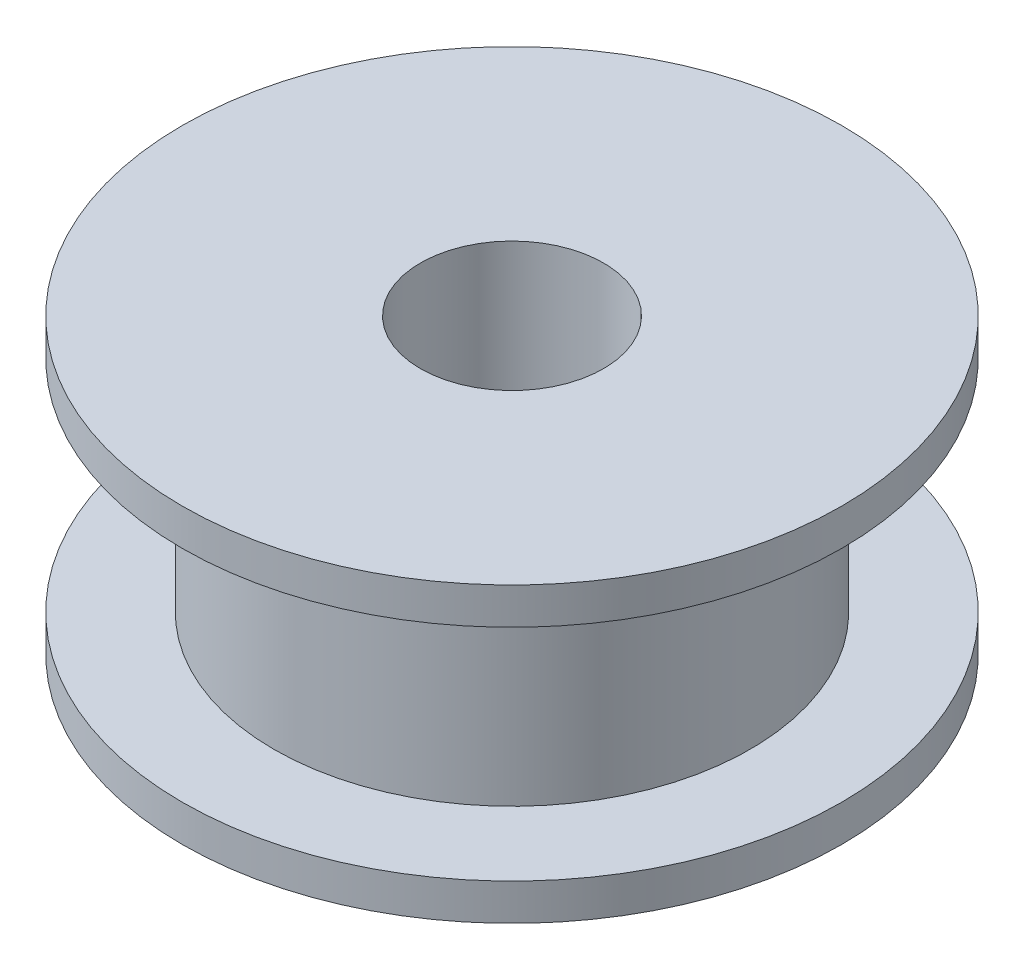
ISO-10303-21;
HEADER;
FILE_DESCRIPTION(('STEP AP214'),'2;1');
FILE_NAME('part.step','',(''),(''),'','','');
FILE_SCHEMA(('AUTOMOTIVE_DESIGN { 1 0 10303 214 1 1 1 1 }'));
ENDSEC;
DATA;
#1=APPLICATION_CONTEXT('core data for automotive mechanical design processes');
#2=APPLICATION_PROTOCOL_DEFINITION('international standard','automotive_design',2000,#1);
#3=PRODUCT_CONTEXT('',#1,'mechanical');
#4=PRODUCT('Part','Part','',(#3));
#5=PRODUCT_RELATED_PRODUCT_CATEGORY('part','',(#4));
#6=PRODUCT_DEFINITION_FORMATION('','',#4);
#7=PRODUCT_DEFINITION_CONTEXT('part definition',#1,'design');
#8=PRODUCT_DEFINITION('design','',#6,#7);
#9=PRODUCT_DEFINITION_SHAPE('','',#8);
#10=(LENGTH_UNIT() NAMED_UNIT(*) SI_UNIT(.MILLI.,.METRE.));
#11=(NAMED_UNIT(*) PLANE_ANGLE_UNIT() SI_UNIT($,.RADIAN.));
#12=(NAMED_UNIT(*) SI_UNIT($,.STERADIAN.) SOLID_ANGLE_UNIT());
#13=UNCERTAINTY_MEASURE_WITH_UNIT(LENGTH_MEASURE(1.E-05),#10,'distance_accuracy_value','');
#14=(GEOMETRIC_REPRESENTATION_CONTEXT(3) GLOBAL_UNCERTAINTY_ASSIGNED_CONTEXT((#13)) GLOBAL_UNIT_ASSIGNED_CONTEXT((#10,
#11,#12)) REPRESENTATION_CONTEXT('',''));
#15=CARTESIAN_POINT('',(0.,0.,0.));
#16=DIRECTION('',(0.,0.,1.));
#17=DIRECTION('',(1.,0.,0.));
#18=AXIS2_PLACEMENT_3D('',#15,#16,#17);
#19=CARTESIAN_POINT('',(0.,1.,0.));
#20=DIRECTION('',(0.,1.,0.));
#21=DIRECTION('',(0.,0.,1.));
#22=AXIS2_PLACEMENT_3D('',#19,#20,#21);
#23=PLANE('',#22);
#24=CARTESIAN_POINT('',(0.,1.,0.));
#25=DIRECTION('',(0.,1.,0.));
#26=DIRECTION('',(0.,0.,1.));
#27=AXIS2_PLACEMENT_3D('',#24,#25,#26);
#28=CIRCLE('',#27,9.);
#29=CARTESIAN_POINT('',(0.,1.,9.));
#30=VERTEX_POINT('',#29);
#31=EDGE_CURVE('E10',#30,#30,#28,.T.);
#32=ORIENTED_EDGE('',*,*,#31,.T.);
#33=EDGE_LOOP('',(#32));
#34=FACE_BOUND('',#33,.T.);
#35=CARTESIAN_POINT('',(0.,1.,0.));
#36=DIRECTION('',(0.,1.,0.));
#37=DIRECTION('',(0.,0.,1.));
#38=AXIS2_PLACEMENT_3D('',#35,#36,#37);
#39=CIRCLE('',#38,6.5);
#40=CARTESIAN_POINT('',(0.,1.,6.5));
#41=VERTEX_POINT('',#40);
#42=EDGE_CURVE('E46',#41,#41,#39,.T.);
#43=ORIENTED_EDGE('',*,*,#42,.F.);
#44=EDGE_LOOP('',(#43));
#45=FACE_BOUND('',#44,.T.);
#46=ADVANCED_FACE('F30',(#34,#45),#23,.T.);
#47=CARTESIAN_POINT('',(0.,0.,0.));
#48=DIRECTION('',(0.,1.,0.));
#49=DIRECTION('',(0.,0.,1.));
#50=AXIS2_PLACEMENT_3D('',#47,#48,#49);
#51=PLANE('',#50);
#52=CARTESIAN_POINT('',(0.,0.,0.));
#53=DIRECTION('',(0.,1.,0.));
#54=DIRECTION('',(0.,0.,1.));
#55=AXIS2_PLACEMENT_3D('',#52,#53,#54);
#56=CIRCLE('',#55,9.);
#57=CARTESIAN_POINT('',(0.,0.,9.));
#58=VERTEX_POINT('',#57);
#59=EDGE_CURVE('E34',#58,#58,#56,.T.);
#60=ORIENTED_EDGE('',*,*,#59,.F.);
#61=EDGE_LOOP('',(#60));
#62=FACE_BOUND('',#61,.T.);
#63=CARTESIAN_POINT('',(0.,0.,0.));
#64=DIRECTION('',(0.,1.,0.));
#65=DIRECTION('',(0.,0.,1.));
#66=AXIS2_PLACEMENT_3D('',#63,#64,#65);
#67=CIRCLE('',#66,2.5);
#68=CARTESIAN_POINT('',(0.,0.,2.5));
#69=VERTEX_POINT('',#68);
#70=EDGE_CURVE('E41',#69,#69,#67,.T.);
#71=ORIENTED_EDGE('',*,*,#70,.T.);
#72=EDGE_LOOP('',(#71));
#73=FACE_BOUND('',#72,.T.);
#74=ADVANCED_FACE('F79',(#62,#73),#51,.F.);
#75=CARTESIAN_POINT('',(0.,1.,0.));
#76=DIRECTION('',(0.,-1.,0.));
#77=DIRECTION('',(0.,0.,-1.));
#78=AXIS2_PLACEMENT_3D('',#75,#76,#77);
#79=CYLINDRICAL_SURFACE('',#78,9.);
#80=ORIENTED_EDGE('',*,*,#31,.F.);
#81=EDGE_LOOP('',(#80));
#82=FACE_BOUND('',#81,.T.);
#83=ORIENTED_EDGE('',*,*,#59,.T.);
#84=EDGE_LOOP('',(#83));
#85=FACE_BOUND('',#84,.T.);
#86=ADVANCED_FACE('F32',(#82,#85),#79,.T.);
#87=CARTESIAN_POINT('',(0.,1.,0.));
#88=DIRECTION('',(0.,-1.,0.));
#89=DIRECTION('',(0.,0.,-1.));
#90=AXIS2_PLACEMENT_3D('',#87,#88,#89);
#91=CYLINDRICAL_SURFACE('',#90,2.5);
#92=ORIENTED_EDGE('',*,*,#70,.F.);
#93=EDGE_LOOP('',(#92));
#94=FACE_BOUND('',#93,.T.);
#95=CARTESIAN_POINT('',(0.,8.,0.));
#96=DIRECTION('',(0.,1.,0.));
#97=DIRECTION('',(0.,0.,1.));
#98=AXIS2_PLACEMENT_3D('',#95,#96,#97);
#99=CIRCLE('',#98,2.5);
#100=CARTESIAN_POINT('',(0.,8.,2.5));
#101=VERTEX_POINT('',#100);
#102=EDGE_CURVE('E55',#101,#101,#99,.T.);
#103=ORIENTED_EDGE('',*,*,#102,.T.);
#104=EDGE_LOOP('',(#103));
#105=FACE_BOUND('',#104,.T.);
#106=ADVANCED_FACE('F61',(#94,#105),#91,.F.);
#107=CARTESIAN_POINT('',(0.,7.,0.));
#108=DIRECTION('',(0.,-1.,0.));
#109=DIRECTION('',(0.,0.,-1.));
#110=AXIS2_PLACEMENT_3D('',#107,#108,#109);
#111=CYLINDRICAL_SURFACE('',#110,6.5);
#112=CARTESIAN_POINT('',(0.,7.,0.));
#113=DIRECTION('',(0.,1.,0.));
#114=DIRECTION('',(0.,0.,1.));
#115=AXIS2_PLACEMENT_3D('',#112,#113,#114);
#116=CIRCLE('',#115,6.5);
#117=CARTESIAN_POINT('',(0.,7.,6.5));
#118=VERTEX_POINT('',#117);
#119=EDGE_CURVE('E45',#118,#118,#116,.T.);
#120=ORIENTED_EDGE('',*,*,#119,.F.);
#121=EDGE_LOOP('',(#120));
#122=FACE_BOUND('',#121,.T.);
#123=ORIENTED_EDGE('',*,*,#42,.T.);
#124=EDGE_LOOP('',(#123));
#125=FACE_BOUND('',#124,.T.);
#126=ADVANCED_FACE('F75',(#122,#125),#111,.T.);
#127=CARTESIAN_POINT('',(0.,7.,0.));
#128=DIRECTION('',(0.,1.,0.));
#129=DIRECTION('',(0.,0.,1.));
#130=AXIS2_PLACEMENT_3D('',#127,#128,#129);
#131=PLANE('',#130);
#132=CARTESIAN_POINT('',(0.,7.,0.));
#133=DIRECTION('',(0.,1.,0.));
#134=DIRECTION('',(0.,0.,1.));
#135=AXIS2_PLACEMENT_3D('',#132,#133,#134);
#136=CIRCLE('',#135,9.);
#137=CARTESIAN_POINT('',(0.,7.,9.));
#138=VERTEX_POINT('',#137);
#139=EDGE_CURVE('E52',#138,#138,#136,.T.);
#140=ORIENTED_EDGE('',*,*,#139,.F.);
#141=EDGE_LOOP('',(#140));
#142=FACE_BOUND('',#141,.T.);
#143=ORIENTED_EDGE('',*,*,#119,.T.);
#144=EDGE_LOOP('',(#143));
#145=FACE_BOUND('',#144,.T.);
#146=ADVANCED_FACE('F66',(#142,#145),#131,.F.);
#147=CARTESIAN_POINT('',(0.,8.,0.));
#148=DIRECTION('',(0.,1.,0.));
#149=DIRECTION('',(0.,0.,1.));
#150=AXIS2_PLACEMENT_3D('',#147,#148,#149);
#151=PLANE('',#150);
#152=CARTESIAN_POINT('',(0.,8.,0.));
#153=DIRECTION('',(0.,1.,0.));
#154=DIRECTION('',(0.,0.,1.));
#155=AXIS2_PLACEMENT_3D('',#152,#153,#154);
#156=CIRCLE('',#155,9.);
#157=CARTESIAN_POINT('',(0.,8.,9.));
#158=VERTEX_POINT('',#157);
#159=EDGE_CURVE('E49',#158,#158,#156,.T.);
#160=ORIENTED_EDGE('',*,*,#159,.T.);
#161=EDGE_LOOP('',(#160));
#162=FACE_BOUND('',#161,.T.);
#163=ORIENTED_EDGE('',*,*,#102,.F.);
#164=EDGE_LOOP('',(#163));
#165=FACE_BOUND('',#164,.T.);
#166=ADVANCED_FACE('F63',(#162,#165),#151,.T.);
#167=CARTESIAN_POINT('',(0.,8.,0.));
#168=DIRECTION('',(0.,-1.,0.));
#169=DIRECTION('',(0.,0.,-1.));
#170=AXIS2_PLACEMENT_3D('',#167,#168,#169);
#171=CYLINDRICAL_SURFACE('',#170,9.);
#172=ORIENTED_EDGE('',*,*,#159,.F.);
#173=EDGE_LOOP('',(#172));
#174=FACE_BOUND('',#173,.T.);
#175=ORIENTED_EDGE('',*,*,#139,.T.);
#176=EDGE_LOOP('',(#175));
#177=FACE_BOUND('',#176,.T.);
#178=ADVANCED_FACE('F65',(#174,#177),#171,.T.);
#179=CLOSED_SHELL('',(#46,#74,#86,#106,#126,#146,#166,#178));
#180=MANIFOLD_SOLID_BREP('B2',#179);
#181=ADVANCED_BREP_SHAPE_REPRESENTATION('',(#18,#180),#14);
#182=SHAPE_DEFINITION_REPRESENTATION(#9,#181);
ENDSEC;
END-ISO-10303-21;
